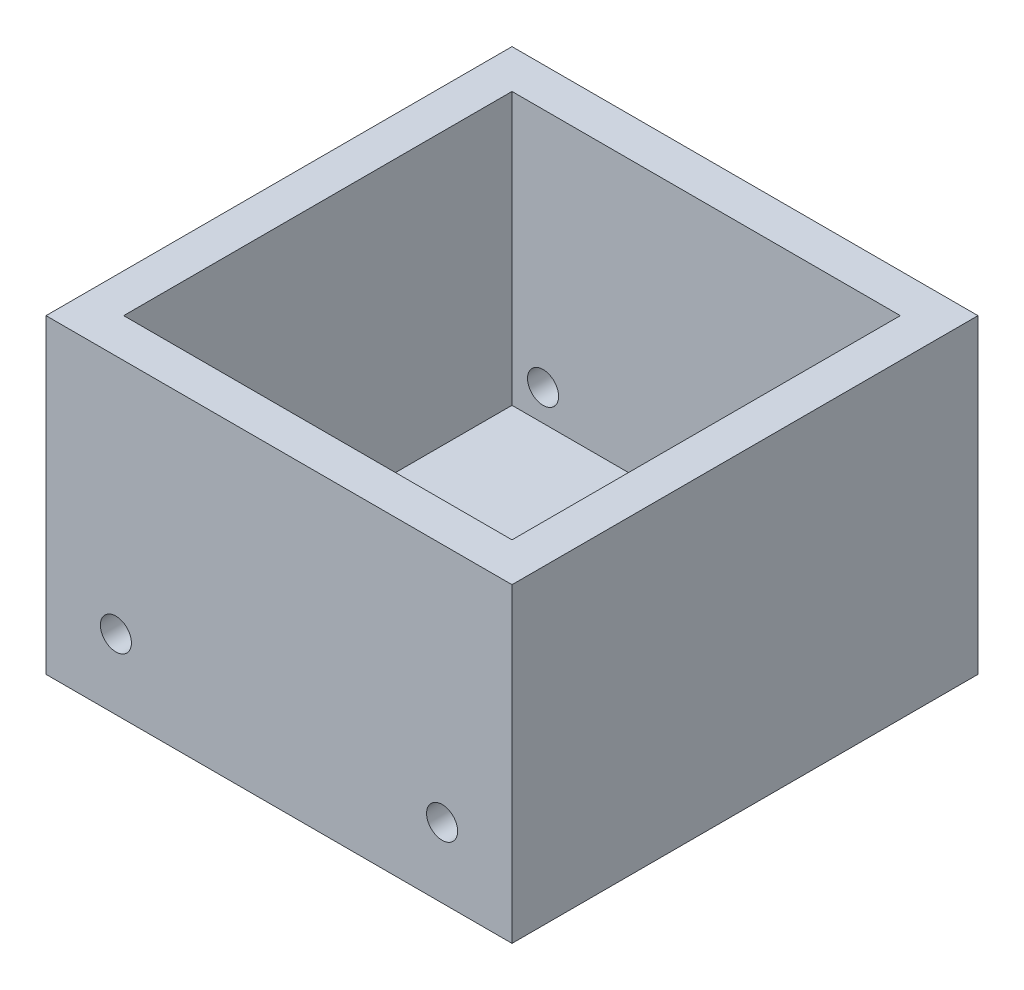
ISO-10303-21;
HEADER;
FILE_DESCRIPTION(('STEP AP214'),'2;1');
FILE_NAME('part.step','',(''),(''),'','','');
FILE_SCHEMA(('AUTOMOTIVE_DESIGN { 1 0 10303 214 1 1 1 1 }'));
ENDSEC;
DATA;
#1=APPLICATION_CONTEXT('core data for automotive mechanical design processes');
#2=APPLICATION_PROTOCOL_DEFINITION('international standard','automotive_design',2000,#1);
#3=PRODUCT_CONTEXT('',#1,'mechanical');
#4=PRODUCT('Part','Part','',(#3));
#5=PRODUCT_RELATED_PRODUCT_CATEGORY('part','',(#4));
#6=PRODUCT_DEFINITION_FORMATION('','',#4);
#7=PRODUCT_DEFINITION_CONTEXT('part definition',#1,'design');
#8=PRODUCT_DEFINITION('design','',#6,#7);
#9=PRODUCT_DEFINITION_SHAPE('','',#8);
#10=(LENGTH_UNIT() NAMED_UNIT(*) SI_UNIT(.MILLI.,.METRE.));
#11=(NAMED_UNIT(*) PLANE_ANGLE_UNIT() SI_UNIT($,.RADIAN.));
#12=(NAMED_UNIT(*) SI_UNIT($,.STERADIAN.) SOLID_ANGLE_UNIT());
#13=UNCERTAINTY_MEASURE_WITH_UNIT(LENGTH_MEASURE(1.E-05),#10,'distance_accuracy_value','');
#14=(GEOMETRIC_REPRESENTATION_CONTEXT(3) GLOBAL_UNCERTAINTY_ASSIGNED_CONTEXT((#13)) GLOBAL_UNIT_ASSIGNED_CONTEXT((#10,
#11,#12)) REPRESENTATION_CONTEXT('',''));
#15=CARTESIAN_POINT('',(0.,0.,0.));
#16=DIRECTION('',(0.,0.,1.));
#17=DIRECTION('',(1.,0.,0.));
#18=AXIS2_PLACEMENT_3D('',#15,#16,#17);
#19=CARTESIAN_POINT('',(0.,101.6,0.));
#20=DIRECTION('',(0.,-1.,0.));
#21=DIRECTION('',(0.,0.,-1.));
#22=AXIS2_PLACEMENT_3D('',#19,#20,#21);
#23=PLANE('',#22);
#24=DIRECTION('',(0.,0.,-1.));
#25=VECTOR('',#24,1.);
#26=CARTESIAN_POINT('',(76.2,101.6,76.2));
#27=LINE('',#26,#25);
#28=CARTESIAN_POINT('',(76.2,101.6,76.2));
#29=VERTEX_POINT('',#28);
#30=CARTESIAN_POINT('',(76.2,101.6,-76.2));
#31=VERTEX_POINT('',#30);
#32=EDGE_CURVE('E144',#29,#31,#27,.T.);
#33=ORIENTED_EDGE('',*,*,#32,.T.);
#34=DIRECTION('',(-1.,0.,0.));
#35=VECTOR('',#34,1.);
#36=CARTESIAN_POINT('',(-76.2,101.6,-76.2));
#37=LINE('',#36,#35);
#38=CARTESIAN_POINT('',(-76.2,101.6,-76.2));
#39=VERTEX_POINT('',#38);
#40=EDGE_CURVE('E88',#31,#39,#37,.T.);
#41=ORIENTED_EDGE('',*,*,#40,.T.);
#42=DIRECTION('',(0.,0.,1.));
#43=VECTOR('',#42,1.);
#44=CARTESIAN_POINT('',(-76.2,101.6,76.2));
#45=LINE('',#44,#43);
#46=CARTESIAN_POINT('',(-76.2,101.6,76.2));
#47=VERTEX_POINT('',#46);
#48=EDGE_CURVE('E147',#39,#47,#45,.T.);
#49=ORIENTED_EDGE('',*,*,#48,.T.);
#50=DIRECTION('',(1.,0.,0.));
#51=VECTOR('',#50,1.);
#52=CARTESIAN_POINT('',(-76.2,101.6,76.2));
#53=LINE('',#52,#51);
#54=EDGE_CURVE('E60',#47,#29,#53,.T.);
#55=ORIENTED_EDGE('',*,*,#54,.T.);
#56=EDGE_LOOP('',(#33,#41,#49,#55));
#57=FACE_BOUND('',#56,.T.);
#58=DIRECTION('',(0.,0.,-1.));
#59=VECTOR('',#58,1.);
#60=CARTESIAN_POINT('',(63.5,101.6,0.));
#61=LINE('',#60,#59);
#62=CARTESIAN_POINT('',(63.5,101.6,63.5));
#63=VERTEX_POINT('',#62);
#64=CARTESIAN_POINT('',(63.5,101.6,-63.5));
#65=VERTEX_POINT('',#64);
#66=EDGE_CURVE('E133',#63,#65,#61,.T.);
#67=ORIENTED_EDGE('',*,*,#66,.F.);
#68=DIRECTION('',(1.,0.,0.));
#69=VECTOR('',#68,1.);
#70=CARTESIAN_POINT('',(0.,101.6,63.5));
#71=LINE('',#70,#69);
#72=CARTESIAN_POINT('',(-63.5,101.6,63.5));
#73=VERTEX_POINT('',#72);
#74=EDGE_CURVE('E142',#73,#63,#71,.T.);
#75=ORIENTED_EDGE('',*,*,#74,.F.);
#76=DIRECTION('',(0.,0.,1.));
#77=VECTOR('',#76,1.);
#78=CARTESIAN_POINT('',(-63.5,101.6,0.));
#79=LINE('',#78,#77);
#80=CARTESIAN_POINT('',(-63.5,101.6,-63.5));
#81=VERTEX_POINT('',#80);
#82=EDGE_CURVE('E140',#81,#73,#79,.T.);
#83=ORIENTED_EDGE('',*,*,#82,.F.);
#84=DIRECTION('',(-1.,0.,0.));
#85=VECTOR('',#84,1.);
#86=CARTESIAN_POINT('',(0.,101.6,-63.5));
#87=LINE('',#86,#85);
#88=EDGE_CURVE('E125',#65,#81,#87,.T.);
#89=ORIENTED_EDGE('',*,*,#88,.F.);
#90=EDGE_LOOP('',(#67,#75,#83,#89));
#91=FACE_BOUND('',#90,.T.);
#92=ADVANCED_FACE('F34',(#57,#91),#23,.F.);
#93=CARTESIAN_POINT('',(76.2,101.6,76.2));
#94=DIRECTION('',(-1.,0.,0.));
#95=DIRECTION('',(0.,0.,1.));
#96=AXIS2_PLACEMENT_3D('',#93,#94,#95);
#97=PLANE('',#96);
#98=DIRECTION('',(0.,0.,-1.));
#99=VECTOR('',#98,1.);
#100=CARTESIAN_POINT('',(76.2,0.,76.2));
#101=LINE('',#100,#99);
#102=CARTESIAN_POINT('',(76.2,0.,76.2));
#103=VERTEX_POINT('',#102);
#104=CARTESIAN_POINT('',(76.2,0.,-76.2));
#105=VERTEX_POINT('',#104);
#106=EDGE_CURVE('E151',#103,#105,#101,.T.);
#107=ORIENTED_EDGE('',*,*,#106,.T.);
#108=DIRECTION('',(0.,-1.,0.));
#109=VECTOR('',#108,1.);
#110=CARTESIAN_POINT('',(76.2,101.6,-76.2));
#111=LINE('',#110,#109);
#112=EDGE_CURVE('E11',#31,#105,#111,.T.);
#113=ORIENTED_EDGE('',*,*,#112,.F.);
#114=ORIENTED_EDGE('',*,*,#32,.F.);
#115=DIRECTION('',(0.,-1.,0.));
#116=VECTOR('',#115,1.);
#117=CARTESIAN_POINT('',(76.2,101.6,76.2));
#118=LINE('',#117,#116);
#119=EDGE_CURVE('E150',#29,#103,#118,.T.);
#120=ORIENTED_EDGE('',*,*,#119,.T.);
#121=EDGE_LOOP('',(#107,#113,#114,#120));
#122=FACE_BOUND('',#121,.T.);
#123=ADVANCED_FACE('F36',(#122),#97,.F.);
#124=CARTESIAN_POINT('',(-76.2,101.6,-76.2));
#125=DIRECTION('',(0.,0.,1.));
#126=DIRECTION('',(1.,0.,0.));
#127=AXIS2_PLACEMENT_3D('',#124,#125,#126);
#128=PLANE('',#127);
#129=CARTESIAN_POINT('',(-53.34,22.86,-76.2));
#130=DIRECTION('',(0.,0.,1.));
#131=DIRECTION('',(1.,0.,0.));
#132=AXIS2_PLACEMENT_3D('',#129,#130,#131);
#133=CIRCLE('',#132,5.08);
#134=CARTESIAN_POINT('',(-48.26,22.86,-76.2));
#135=VERTEX_POINT('',#134);
#136=EDGE_CURVE('E218',#135,#135,#133,.T.);
#137=ORIENTED_EDGE('',*,*,#136,.T.);
#138=EDGE_LOOP('',(#137));
#139=FACE_BOUND('',#138,.T.);
#140=CARTESIAN_POINT('',(53.34,22.8600000000001,-76.2));
#141=DIRECTION('',(0.,0.,1.));
#142=DIRECTION('',(-1.,0.,0.));
#143=AXIS2_PLACEMENT_3D('',#140,#141,#142);
#144=CIRCLE('',#143,5.08);
#145=CARTESIAN_POINT('',(58.42,22.8600000000001,-76.2));
#146=VERTEX_POINT('',#145);
#147=EDGE_CURVE('E221',#146,#146,#144,.T.);
#148=ORIENTED_EDGE('',*,*,#147,.T.);
#149=EDGE_LOOP('',(#148));
#150=FACE_BOUND('',#149,.T.);
#151=DIRECTION('',(-1.,0.,0.));
#152=VECTOR('',#151,1.);
#153=CARTESIAN_POINT('',(-76.2,0.,-76.2));
#154=LINE('',#153,#152);
#155=CARTESIAN_POINT('',(-76.2,0.,-76.2));
#156=VERTEX_POINT('',#155);
#157=EDGE_CURVE('E154',#105,#156,#154,.T.);
#158=ORIENTED_EDGE('',*,*,#157,.T.);
#159=DIRECTION('',(0.,-1.,0.));
#160=VECTOR('',#159,1.);
#161=CARTESIAN_POINT('',(-76.2,101.6,-76.2));
#162=LINE('',#161,#160);
#163=EDGE_CURVE('E43',#39,#156,#162,.T.);
#164=ORIENTED_EDGE('',*,*,#163,.F.);
#165=ORIENTED_EDGE('',*,*,#40,.F.);
#166=ORIENTED_EDGE('',*,*,#112,.T.);
#167=EDGE_LOOP('',(#158,#164,#165,#166));
#168=FACE_BOUND('',#167,.T.);
#169=ADVANCED_FACE('F195',(#139,#150,#168),#128,.F.);
#170=CARTESIAN_POINT('',(-76.2,101.6,76.2));
#171=DIRECTION('',(1.,0.,0.));
#172=DIRECTION('',(0.,0.,-1.));
#173=AXIS2_PLACEMENT_3D('',#170,#171,#172);
#174=PLANE('',#173);
#175=DIRECTION('',(0.,0.,1.));
#176=VECTOR('',#175,1.);
#177=CARTESIAN_POINT('',(-76.2,0.,76.2));
#178=LINE('',#177,#176);
#179=CARTESIAN_POINT('',(-76.2,0.,76.2));
#180=VERTEX_POINT('',#179);
#181=EDGE_CURVE('E156',#156,#180,#178,.T.);
#182=ORIENTED_EDGE('',*,*,#181,.T.);
#183=DIRECTION('',(0.,-1.,0.));
#184=VECTOR('',#183,1.);
#185=CARTESIAN_POINT('',(-76.2,101.6,76.2));
#186=LINE('',#185,#184);
#187=EDGE_CURVE('E160',#47,#180,#186,.T.);
#188=ORIENTED_EDGE('',*,*,#187,.F.);
#189=ORIENTED_EDGE('',*,*,#48,.F.);
#190=ORIENTED_EDGE('',*,*,#163,.T.);
#191=EDGE_LOOP('',(#182,#188,#189,#190));
#192=FACE_BOUND('',#191,.T.);
#193=ADVANCED_FACE('F207',(#192),#174,.F.);
#194=CARTESIAN_POINT('',(-76.2,101.6,76.2));
#195=DIRECTION('',(0.,0.,-1.));
#196=DIRECTION('',(-1.,0.,0.));
#197=AXIS2_PLACEMENT_3D('',#194,#195,#196);
#198=PLANE('',#197);
#199=CARTESIAN_POINT('',(-53.34,22.86,76.2));
#200=DIRECTION('',(0.,0.,1.));
#201=DIRECTION('',(1.,0.,0.));
#202=AXIS2_PLACEMENT_3D('',#199,#200,#201);
#203=CIRCLE('',#202,5.08);
#204=CARTESIAN_POINT('',(-48.26,22.86,76.2));
#205=VERTEX_POINT('',#204);
#206=EDGE_CURVE('E165',#205,#205,#203,.T.);
#207=ORIENTED_EDGE('',*,*,#206,.F.);
#208=EDGE_LOOP('',(#207));
#209=FACE_BOUND('',#208,.T.);
#210=CARTESIAN_POINT('',(53.34,22.8600000000001,76.2));
#211=DIRECTION('',(0.,0.,1.));
#212=DIRECTION('',(-1.,0.,0.));
#213=AXIS2_PLACEMENT_3D('',#210,#211,#212);
#214=CIRCLE('',#213,5.08);
#215=CARTESIAN_POINT('',(48.26,22.8600000000001,76.2));
#216=VERTEX_POINT('',#215);
#217=EDGE_CURVE('E170',#216,#216,#214,.T.);
#218=ORIENTED_EDGE('',*,*,#217,.F.);
#219=EDGE_LOOP('',(#218));
#220=FACE_BOUND('',#219,.T.);
#221=DIRECTION('',(1.,0.,0.));
#222=VECTOR('',#221,1.);
#223=CARTESIAN_POINT('',(-76.2,0.,76.2));
#224=LINE('',#223,#222);
#225=EDGE_CURVE('E81',#180,#103,#224,.T.);
#226=ORIENTED_EDGE('',*,*,#225,.T.);
#227=ORIENTED_EDGE('',*,*,#119,.F.);
#228=ORIENTED_EDGE('',*,*,#54,.F.);
#229=ORIENTED_EDGE('',*,*,#187,.T.);
#230=EDGE_LOOP('',(#226,#227,#228,#229));
#231=FACE_BOUND('',#230,.T.);
#232=ADVANCED_FACE('F203',(#209,#220,#231),#198,.F.);
#233=CARTESIAN_POINT('',(0.,0.,0.));
#234=DIRECTION('',(0.,-1.,0.));
#235=DIRECTION('',(0.,0.,-1.));
#236=AXIS2_PLACEMENT_3D('',#233,#234,#235);
#237=PLANE('',#236);
#238=ORIENTED_EDGE('',*,*,#106,.F.);
#239=ORIENTED_EDGE('',*,*,#225,.F.);
#240=ORIENTED_EDGE('',*,*,#181,.F.);
#241=ORIENTED_EDGE('',*,*,#157,.F.);
#242=EDGE_LOOP('',(#238,#239,#240,#241));
#243=FACE_BOUND('',#242,.T.);
#244=ADVANCED_FACE('F200',(#243),#237,.T.);
#245=CARTESIAN_POINT('',(63.5,101.6,76.2));
#246=DIRECTION('',(-1.,0.,0.));
#247=DIRECTION('',(0.,0.,1.));
#248=AXIS2_PLACEMENT_3D('',#245,#246,#247);
#249=PLANE('',#248);
#250=DIRECTION('',(0.,0.,-1.));
#251=VECTOR('',#250,1.);
#252=CARTESIAN_POINT('',(63.5,12.7,0.));
#253=LINE('',#252,#251);
#254=CARTESIAN_POINT('',(63.5,12.7,63.5));
#255=VERTEX_POINT('',#254);
#256=CARTESIAN_POINT('',(63.5,12.7,-63.5));
#257=VERTEX_POINT('',#256);
#258=EDGE_CURVE('E116',#255,#257,#253,.T.);
#259=ORIENTED_EDGE('',*,*,#258,.F.);
#260=DIRECTION('',(0.,-1.,0.));
#261=VECTOR('',#260,1.);
#262=CARTESIAN_POINT('',(63.5,101.6,63.5));
#263=LINE('',#262,#261);
#264=EDGE_CURVE('E136',#63,#255,#263,.T.);
#265=ORIENTED_EDGE('',*,*,#264,.F.);
#266=ORIENTED_EDGE('',*,*,#66,.T.);
#267=DIRECTION('',(0.,-1.,0.));
#268=VECTOR('',#267,1.);
#269=CARTESIAN_POINT('',(63.5,101.6,-63.5));
#270=LINE('',#269,#268);
#271=EDGE_CURVE('E128',#65,#257,#270,.T.);
#272=ORIENTED_EDGE('',*,*,#271,.T.);
#273=EDGE_LOOP('',(#259,#265,#266,#272));
#274=FACE_BOUND('',#273,.T.);
#275=ADVANCED_FACE('F188',(#274),#249,.T.);
#276=CARTESIAN_POINT('',(-76.2,101.6,-63.5));
#277=DIRECTION('',(0.,0.,1.));
#278=DIRECTION('',(1.,0.,0.));
#279=AXIS2_PLACEMENT_3D('',#276,#277,#278);
#280=PLANE('',#279);
#281=CARTESIAN_POINT('',(-53.34,22.86,-63.5));
#282=DIRECTION('',(0.,0.,1.));
#283=DIRECTION('',(1.,0.,0.));
#284=AXIS2_PLACEMENT_3D('',#281,#282,#283);
#285=CIRCLE('',#284,5.08);
#286=CARTESIAN_POINT('',(-48.26,22.86,-63.5));
#287=VERTEX_POINT('',#286);
#288=EDGE_CURVE('E175',#287,#287,#285,.T.);
#289=ORIENTED_EDGE('',*,*,#288,.F.);
#290=EDGE_LOOP('',(#289));
#291=FACE_BOUND('',#290,.T.);
#292=CARTESIAN_POINT('',(53.34,22.8600000000001,-63.5));
#293=DIRECTION('',(0.,0.,1.));
#294=DIRECTION('',(1.,0.,0.));
#295=AXIS2_PLACEMENT_3D('',#292,#293,#294);
#296=CIRCLE('',#295,5.08);
#297=CARTESIAN_POINT('',(58.42,22.8600000000001,-63.5));
#298=VERTEX_POINT('',#297);
#299=EDGE_CURVE('E230',#298,#298,#296,.T.);
#300=ORIENTED_EDGE('',*,*,#299,.F.);
#301=EDGE_LOOP('',(#300));
#302=FACE_BOUND('',#301,.T.);
#303=DIRECTION('',(-1.,0.,0.));
#304=VECTOR('',#303,1.);
#305=CARTESIAN_POINT('',(0.,12.7,-63.5));
#306=LINE('',#305,#304);
#307=CARTESIAN_POINT('',(-63.5,12.7,-63.5));
#308=VERTEX_POINT('',#307);
#309=EDGE_CURVE('E110',#257,#308,#306,.T.);
#310=ORIENTED_EDGE('',*,*,#309,.F.);
#311=ORIENTED_EDGE('',*,*,#271,.F.);
#312=ORIENTED_EDGE('',*,*,#88,.T.);
#313=DIRECTION('',(0.,-1.,0.));
#314=VECTOR('',#313,1.);
#315=CARTESIAN_POINT('',(-63.5,101.6,-63.5));
#316=LINE('',#315,#314);
#317=EDGE_CURVE('E122',#81,#308,#316,.T.);
#318=ORIENTED_EDGE('',*,*,#317,.T.);
#319=EDGE_LOOP('',(#310,#311,#312,#318));
#320=FACE_BOUND('',#319,.T.);
#321=ADVANCED_FACE('F123',(#291,#302,#320),#280,.T.);
#322=CARTESIAN_POINT('',(-63.5,101.6,76.2));
#323=DIRECTION('',(1.,0.,0.));
#324=DIRECTION('',(0.,0.,-1.));
#325=AXIS2_PLACEMENT_3D('',#322,#323,#324);
#326=PLANE('',#325);
#327=DIRECTION('',(0.,0.,1.));
#328=VECTOR('',#327,1.);
#329=CARTESIAN_POINT('',(-63.5,12.7,0.));
#330=LINE('',#329,#328);
#331=CARTESIAN_POINT('',(-63.5,12.7,63.5));
#332=VERTEX_POINT('',#331);
#333=EDGE_CURVE('E114',#308,#332,#330,.T.);
#334=ORIENTED_EDGE('',*,*,#333,.F.);
#335=ORIENTED_EDGE('',*,*,#317,.F.);
#336=ORIENTED_EDGE('',*,*,#82,.T.);
#337=DIRECTION('',(0.,-1.,0.));
#338=VECTOR('',#337,1.);
#339=CARTESIAN_POINT('',(-63.5,101.6,63.5));
#340=LINE('',#339,#338);
#341=EDGE_CURVE('E51',#73,#332,#340,.T.);
#342=ORIENTED_EDGE('',*,*,#341,.T.);
#343=EDGE_LOOP('',(#334,#335,#336,#342));
#344=FACE_BOUND('',#343,.T.);
#345=ADVANCED_FACE('F130',(#344),#326,.T.);
#346=CARTESIAN_POINT('',(-76.2,101.6,63.5));
#347=DIRECTION('',(0.,0.,-1.));
#348=DIRECTION('',(-1.,0.,0.));
#349=AXIS2_PLACEMENT_3D('',#346,#347,#348);
#350=PLANE('',#349);
#351=CARTESIAN_POINT('',(-53.34,22.86,63.5));
#352=DIRECTION('',(0.,0.,-1.));
#353=DIRECTION('',(-1.,0.,0.));
#354=AXIS2_PLACEMENT_3D('',#351,#352,#353);
#355=CIRCLE('',#354,5.08);
#356=CARTESIAN_POINT('',(-58.42,22.86,63.5));
#357=VERTEX_POINT('',#356);
#358=EDGE_CURVE('E38',#357,#357,#355,.F.);
#359=ORIENTED_EDGE('',*,*,#358,.T.);
#360=EDGE_LOOP('',(#359));
#361=FACE_BOUND('',#360,.T.);
#362=CARTESIAN_POINT('',(53.34,22.8600000000001,63.5));
#363=DIRECTION('',(0.,0.,-1.));
#364=DIRECTION('',(-1.,0.,0.));
#365=AXIS2_PLACEMENT_3D('',#362,#363,#364);
#366=CIRCLE('',#365,5.08);
#367=CARTESIAN_POINT('',(48.26,22.8600000000001,63.5));
#368=VERTEX_POINT('',#367);
#369=EDGE_CURVE('E163',#368,#368,#366,.F.);
#370=ORIENTED_EDGE('',*,*,#369,.T.);
#371=EDGE_LOOP('',(#370));
#372=FACE_BOUND('',#371,.T.);
#373=DIRECTION('',(1.,0.,0.));
#374=VECTOR('',#373,1.);
#375=CARTESIAN_POINT('',(0.,12.7,63.5));
#376=LINE('',#375,#374);
#377=EDGE_CURVE('E131',#332,#255,#376,.T.);
#378=ORIENTED_EDGE('',*,*,#377,.F.);
#379=ORIENTED_EDGE('',*,*,#341,.F.);
#380=ORIENTED_EDGE('',*,*,#74,.T.);
#381=ORIENTED_EDGE('',*,*,#264,.T.);
#382=EDGE_LOOP('',(#378,#379,#380,#381));
#383=FACE_BOUND('',#382,.T.);
#384=ADVANCED_FACE('F184',(#361,#372,#383),#350,.T.);
#385=CARTESIAN_POINT('',(0.,12.7,0.));
#386=DIRECTION('',(0.,-1.,0.));
#387=DIRECTION('',(0.,0.,-1.));
#388=AXIS2_PLACEMENT_3D('',#385,#386,#387);
#389=PLANE('',#388);
#390=ORIENTED_EDGE('',*,*,#258,.T.);
#391=ORIENTED_EDGE('',*,*,#309,.T.);
#392=ORIENTED_EDGE('',*,*,#333,.T.);
#393=ORIENTED_EDGE('',*,*,#377,.T.);
#394=EDGE_LOOP('',(#390,#391,#392,#393));
#395=FACE_BOUND('',#394,.T.);
#396=ADVANCED_FACE('F112',(#395),#389,.F.);
#397=CARTESIAN_POINT('',(53.34,22.8600000000001,76.2));
#398=DIRECTION('',(0.,0.,-1.));
#399=DIRECTION('',(-1.,0.,0.));
#400=AXIS2_PLACEMENT_3D('',#397,#398,#399);
#401=CYLINDRICAL_SURFACE('',#400,5.08);
#402=ORIENTED_EDGE('',*,*,#369,.F.);
#403=EDGE_LOOP('',(#402));
#404=FACE_BOUND('',#403,.T.);
#405=ORIENTED_EDGE('',*,*,#217,.T.);
#406=EDGE_LOOP('',(#405));
#407=FACE_BOUND('',#406,.T.);
#408=ADVANCED_FACE('F256',(#404,#407),#401,.F.);
#409=CARTESIAN_POINT('',(-53.34,22.86,76.2));
#410=DIRECTION('',(0.,0.,-1.));
#411=DIRECTION('',(-1.,0.,0.));
#412=AXIS2_PLACEMENT_3D('',#409,#410,#411);
#413=CYLINDRICAL_SURFACE('',#412,5.08);
#414=ORIENTED_EDGE('',*,*,#358,.F.);
#415=EDGE_LOOP('',(#414));
#416=FACE_BOUND('',#415,.T.);
#417=ORIENTED_EDGE('',*,*,#206,.T.);
#418=EDGE_LOOP('',(#417));
#419=FACE_BOUND('',#418,.T.);
#420=ADVANCED_FACE('F259',(#416,#419),#413,.F.);
#421=CARTESIAN_POINT('',(53.34,22.8600000000001,-76.2));
#422=DIRECTION('',(0.,0.,1.));
#423=DIRECTION('',(1.,0.,0.));
#424=AXIS2_PLACEMENT_3D('',#421,#422,#423);
#425=CYLINDRICAL_SURFACE('',#424,5.08);
#426=CARTESIAN_POINT('',(58.42,22.8600000000001,-63.5));
#427=CARTESIAN_POINT('',(58.42,22.8600000000001,-63.6322916666667));
#428=CARTESIAN_POINT('',(58.42,22.8600000000001,-63.7645833333333));
#429=CARTESIAN_POINT('',(58.42,22.8600000000001,-64.0291666666667));
#430=CARTESIAN_POINT('',(58.42,22.8600000000001,-64.1614583333334));
#431=CARTESIAN_POINT('',(58.42,22.8600000000001,-64.4260416666667));
#432=CARTESIAN_POINT('',(58.42,22.8600000000001,-64.5583333333334));
#433=CARTESIAN_POINT('',(58.42,22.8600000000001,-64.8229166666667));
#434=CARTESIAN_POINT('',(58.42,22.8600000000001,-64.9552083333334));
#435=CARTESIAN_POINT('',(58.42,22.8600000000001,-65.2197916666667));
#436=CARTESIAN_POINT('',(58.42,22.8600000000001,-65.3520833333334));
#437=CARTESIAN_POINT('',(58.42,22.8600000000001,-65.6166666666667));
#438=CARTESIAN_POINT('',(58.42,22.8600000000001,-65.7489583333334));
#439=CARTESIAN_POINT('',(58.42,22.8600000000001,-66.0135416666667));
#440=CARTESIAN_POINT('',(58.42,22.8600000000001,-66.1458333333334));
#441=CARTESIAN_POINT('',(58.42,22.8600000000001,-66.4104166666667));
#442=CARTESIAN_POINT('',(58.42,22.8600000000001,-66.5427083333334));
#443=CARTESIAN_POINT('',(58.42,22.8600000000001,-66.8072916666667));
#444=CARTESIAN_POINT('',(58.42,22.8600000000001,-66.9395833333334));
#445=CARTESIAN_POINT('',(58.42,22.8600000000001,-67.2041666666667));
#446=CARTESIAN_POINT('',(58.42,22.8600000000001,-67.3364583333334));
#447=CARTESIAN_POINT('',(58.42,22.8600000000001,-67.6010416666667));
#448=CARTESIAN_POINT('',(58.42,22.8600000000001,-67.7333333333333));
#449=CARTESIAN_POINT('',(58.42,22.8600000000001,-67.9979166666667));
#450=CARTESIAN_POINT('',(58.42,22.8600000000001,-68.1302083333334));
#451=CARTESIAN_POINT('',(58.42,22.8600000000001,-68.3947916666667));
#452=CARTESIAN_POINT('',(58.42,22.8600000000001,-68.5270833333334));
#453=CARTESIAN_POINT('',(58.42,22.8600000000001,-68.7916666666667));
#454=CARTESIAN_POINT('',(58.42,22.8600000000001,-68.9239583333334));
#455=CARTESIAN_POINT('',(58.42,22.8600000000001,-69.1885416666667));
#456=CARTESIAN_POINT('',(58.42,22.8600000000001,-69.3208333333334));
#457=CARTESIAN_POINT('',(58.42,22.8600000000001,-69.5854166666667));
#458=CARTESIAN_POINT('',(58.42,22.8600000000001,-69.7177083333334));
#459=CARTESIAN_POINT('',(58.42,22.8600000000001,-69.9822916666667));
#460=CARTESIAN_POINT('',(58.42,22.8600000000001,-70.1145833333334));
#461=CARTESIAN_POINT('',(58.42,22.8600000000001,-70.3791666666667));
#462=CARTESIAN_POINT('',(58.42,22.8600000000001,-70.5114583333334));
#463=CARTESIAN_POINT('',(58.42,22.8600000000001,-70.7760416666667));
#464=CARTESIAN_POINT('',(58.42,22.8600000000001,-70.9083333333334));
#465=CARTESIAN_POINT('',(58.42,22.8600000000001,-71.1729166666667));
#466=CARTESIAN_POINT('',(58.42,22.8600000000001,-71.3052083333334));
#467=CARTESIAN_POINT('',(58.42,22.8600000000001,-71.5697916666667));
#468=CARTESIAN_POINT('',(58.42,22.8600000000001,-71.7020833333334));
#469=CARTESIAN_POINT('',(58.42,22.8600000000001,-71.9666666666667));
#470=CARTESIAN_POINT('',(58.42,22.8600000000001,-72.0989583333334));
#471=CARTESIAN_POINT('',(58.42,22.8600000000001,-72.3635416666667));
#472=CARTESIAN_POINT('',(58.42,22.8600000000001,-72.4958333333334));
#473=CARTESIAN_POINT('',(58.42,22.8600000000001,-72.7604166666667));
#474=CARTESIAN_POINT('',(58.42,22.8600000000001,-72.8927083333334));
#475=CARTESIAN_POINT('',(58.42,22.8600000000001,-73.1572916666667));
#476=CARTESIAN_POINT('',(58.42,22.8600000000001,-73.2895833333334));
#477=CARTESIAN_POINT('',(58.42,22.8600000000001,-73.5541666666667));
#478=CARTESIAN_POINT('',(58.42,22.8600000000001,-73.6864583333334));
#479=CARTESIAN_POINT('',(58.42,22.8600000000001,-73.9510416666667));
#480=CARTESIAN_POINT('',(58.42,22.8600000000001,-74.0833333333334));
#481=CARTESIAN_POINT('',(58.42,22.8600000000001,-74.3479166666667));
#482=CARTESIAN_POINT('',(58.42,22.8600000000001,-74.4802083333334));
#483=CARTESIAN_POINT('',(58.42,22.8600000000001,-74.7447916666667));
#484=CARTESIAN_POINT('',(58.42,22.8600000000001,-74.8770833333334));
#485=CARTESIAN_POINT('',(58.42,22.8600000000001,-75.1416666666667));
#486=CARTESIAN_POINT('',(58.42,22.8600000000001,-75.2739583333334));
#487=CARTESIAN_POINT('',(58.42,22.8600000000001,-75.5385416666667));
#488=CARTESIAN_POINT('',(58.42,22.8600000000001,-75.6708333333334));
#489=CARTESIAN_POINT('',(58.42,22.8600000000001,-75.9354166666667));
#490=CARTESIAN_POINT('',(58.42,22.8600000000001,-76.0677083333334));
#491=CARTESIAN_POINT('',(58.42,22.8600000000001,-76.2));
#492=B_SPLINE_CURVE_WITH_KNOTS('',3,(#426,#427,#428,#429,#430,#431,#432,#433,#434,#435,#436,
#437,#438,#439,#440,#441,#442,#443,#444,#445,#446,#447,#448,#449,#450,#451,#452,#453,#454,#455,
#456,#457,#458,#459,#460,#461,#462,#463,#464,#465,#466,#467,#468,#469,#470,#471,#472,#473,#474,
#475,#476,#477,#478,#479,#480,#481,#482,#483,#484,#485,#486,#487,#488,#489,#490,#491),
.UNSPECIFIED.,.F.,.F.,(4,2,2,2,2,2,2,2,2,2,2,2,2,2,2,2,2,2,2,2,2,2,2,2,2,2,2,2,2,2,2,2,4),(0.,
0.396875000000005,0.79375000000001,1.19062500000001,1.58750000000001,1.98437500000001,
2.38125000000002,2.77812500000001,3.17500000000001,3.57187500000002,3.96875000000001,
4.36562500000001,4.76250000000002,5.15937500000001,5.55625000000001,5.95312500000002,
6.35000000000001,6.74687500000001,7.14375000000002,7.54062500000001,7.93750000000001,
8.33437500000002,8.73125000000002,9.12812500000001,9.52500000000002,9.92187500000002,10.31875,
10.715625,11.1125,11.509375,11.90625,12.303125,12.7),.UNSPECIFIED.);
#493=EDGE_CURVE('BSEAM261',#298,#146,#492,.T.);
#494=ORIENTED_EDGE('',*,*,#299,.T.);
#495=ORIENTED_EDGE('',*,*,#147,.F.);
#496=ORIENTED_EDGE('',*,*,#493,.T.);
#497=ORIENTED_EDGE('',*,*,#493,.F.);
#498=EDGE_LOOP('',(#494,#496,#495,#497));
#499=FACE_BOUND('',#498,.T.);
#500=ADVANCED_FACE('F261',(#499),#425,.F.);
#501=CARTESIAN_POINT('',(-53.34,22.86,-76.2));
#502=DIRECTION('',(0.,0.,1.));
#503=DIRECTION('',(1.,0.,0.));
#504=AXIS2_PLACEMENT_3D('',#501,#502,#503);
#505=CYLINDRICAL_SURFACE('',#504,5.08);
#506=CARTESIAN_POINT('',(-48.26,22.86,-63.5));
#507=CARTESIAN_POINT('',(-48.26,22.86,-63.6322916666667));
#508=CARTESIAN_POINT('',(-48.26,22.86,-63.7645833333333));
#509=CARTESIAN_POINT('',(-48.26,22.86,-64.0291666666667));
#510=CARTESIAN_POINT('',(-48.26,22.86,-64.1614583333334));
#511=CARTESIAN_POINT('',(-48.26,22.86,-64.4260416666667));
#512=CARTESIAN_POINT('',(-48.26,22.86,-64.5583333333334));
#513=CARTESIAN_POINT('',(-48.26,22.86,-64.8229166666667));
#514=CARTESIAN_POINT('',(-48.26,22.86,-64.9552083333334));
#515=CARTESIAN_POINT('',(-48.26,22.86,-65.2197916666667));
#516=CARTESIAN_POINT('',(-48.26,22.86,-65.3520833333334));
#517=CARTESIAN_POINT('',(-48.26,22.86,-65.6166666666667));
#518=CARTESIAN_POINT('',(-48.26,22.86,-65.7489583333334));
#519=CARTESIAN_POINT('',(-48.26,22.86,-66.0135416666667));
#520=CARTESIAN_POINT('',(-48.26,22.86,-66.1458333333334));
#521=CARTESIAN_POINT('',(-48.26,22.86,-66.4104166666667));
#522=CARTESIAN_POINT('',(-48.26,22.86,-66.5427083333334));
#523=CARTESIAN_POINT('',(-48.26,22.86,-66.8072916666667));
#524=CARTESIAN_POINT('',(-48.26,22.86,-66.9395833333334));
#525=CARTESIAN_POINT('',(-48.26,22.86,-67.2041666666667));
#526=CARTESIAN_POINT('',(-48.26,22.86,-67.3364583333334));
#527=CARTESIAN_POINT('',(-48.26,22.86,-67.6010416666667));
#528=CARTESIAN_POINT('',(-48.26,22.86,-67.7333333333333));
#529=CARTESIAN_POINT('',(-48.26,22.86,-67.9979166666667));
#530=CARTESIAN_POINT('',(-48.26,22.86,-68.1302083333334));
#531=CARTESIAN_POINT('',(-48.26,22.86,-68.3947916666667));
#532=CARTESIAN_POINT('',(-48.26,22.86,-68.5270833333334));
#533=CARTESIAN_POINT('',(-48.26,22.86,-68.7916666666667));
#534=CARTESIAN_POINT('',(-48.26,22.86,-68.9239583333334));
#535=CARTESIAN_POINT('',(-48.26,22.86,-69.1885416666667));
#536=CARTESIAN_POINT('',(-48.26,22.86,-69.3208333333334));
#537=CARTESIAN_POINT('',(-48.26,22.86,-69.5854166666667));
#538=CARTESIAN_POINT('',(-48.26,22.86,-69.7177083333334));
#539=CARTESIAN_POINT('',(-48.26,22.86,-69.9822916666667));
#540=CARTESIAN_POINT('',(-48.26,22.86,-70.1145833333334));
#541=CARTESIAN_POINT('',(-48.26,22.86,-70.3791666666667));
#542=CARTESIAN_POINT('',(-48.26,22.86,-70.5114583333334));
#543=CARTESIAN_POINT('',(-48.26,22.86,-70.7760416666667));
#544=CARTESIAN_POINT('',(-48.26,22.86,-70.9083333333334));
#545=CARTESIAN_POINT('',(-48.26,22.86,-71.1729166666667));
#546=CARTESIAN_POINT('',(-48.26,22.86,-71.3052083333334));
#547=CARTESIAN_POINT('',(-48.26,22.86,-71.5697916666667));
#548=CARTESIAN_POINT('',(-48.26,22.86,-71.7020833333334));
#549=CARTESIAN_POINT('',(-48.26,22.86,-71.9666666666667));
#550=CARTESIAN_POINT('',(-48.26,22.86,-72.0989583333334));
#551=CARTESIAN_POINT('',(-48.26,22.86,-72.3635416666667));
#552=CARTESIAN_POINT('',(-48.26,22.86,-72.4958333333334));
#553=CARTESIAN_POINT('',(-48.26,22.86,-72.7604166666667));
#554=CARTESIAN_POINT('',(-48.26,22.86,-72.8927083333334));
#555=CARTESIAN_POINT('',(-48.26,22.86,-73.1572916666667));
#556=CARTESIAN_POINT('',(-48.26,22.86,-73.2895833333334));
#557=CARTESIAN_POINT('',(-48.26,22.86,-73.5541666666667));
#558=CARTESIAN_POINT('',(-48.26,22.86,-73.6864583333334));
#559=CARTESIAN_POINT('',(-48.26,22.86,-73.9510416666667));
#560=CARTESIAN_POINT('',(-48.26,22.86,-74.0833333333334));
#561=CARTESIAN_POINT('',(-48.26,22.86,-74.3479166666667));
#562=CARTESIAN_POINT('',(-48.26,22.86,-74.4802083333334));
#563=CARTESIAN_POINT('',(-48.26,22.86,-74.7447916666667));
#564=CARTESIAN_POINT('',(-48.26,22.86,-74.8770833333334));
#565=CARTESIAN_POINT('',(-48.26,22.86,-75.1416666666667));
#566=CARTESIAN_POINT('',(-48.26,22.86,-75.2739583333334));
#567=CARTESIAN_POINT('',(-48.26,22.86,-75.5385416666667));
#568=CARTESIAN_POINT('',(-48.26,22.86,-75.6708333333334));
#569=CARTESIAN_POINT('',(-48.26,22.86,-75.9354166666667));
#570=CARTESIAN_POINT('',(-48.26,22.86,-76.0677083333334));
#571=CARTESIAN_POINT('',(-48.26,22.86,-76.2));
#572=B_SPLINE_CURVE_WITH_KNOTS('',3,(#506,#507,#508,#509,#510,#511,#512,#513,#514,#515,#516,
#517,#518,#519,#520,#521,#522,#523,#524,#525,#526,#527,#528,#529,#530,#531,#532,#533,#534,#535,
#536,#537,#538,#539,#540,#541,#542,#543,#544,#545,#546,#547,#548,#549,#550,#551,#552,#553,#554,
#555,#556,#557,#558,#559,#560,#561,#562,#563,#564,#565,#566,#567,#568,#569,#570,#571),
.UNSPECIFIED.,.F.,.F.,(4,2,2,2,2,2,2,2,2,2,2,2,2,2,2,2,2,2,2,2,2,2,2,2,2,2,2,2,2,2,2,2,4),(0.,
0.396875000000005,0.79375000000001,1.19062500000001,1.58750000000001,1.98437500000001,
2.38125000000002,2.77812500000001,3.17500000000001,3.57187500000002,3.96875000000001,
4.36562500000001,4.76250000000002,5.15937500000001,5.55625000000001,5.95312500000002,
6.35000000000001,6.74687500000001,7.14375000000002,7.54062500000001,7.93750000000001,
8.33437500000002,8.73125000000002,9.12812500000001,9.52500000000002,9.92187500000002,10.31875,
10.715625,11.1125,11.509375,11.90625,12.303125,12.7),.UNSPECIFIED.);
#573=EDGE_CURVE('BSEAM238',#287,#135,#572,.T.);
#574=ORIENTED_EDGE('',*,*,#288,.T.);
#575=ORIENTED_EDGE('',*,*,#136,.F.);
#576=ORIENTED_EDGE('',*,*,#573,.T.);
#577=ORIENTED_EDGE('',*,*,#573,.F.);
#578=EDGE_LOOP('',(#574,#576,#575,#577));
#579=FACE_BOUND('',#578,.T.);
#580=ADVANCED_FACE('F238',(#579),#505,.F.);
#581=CLOSED_SHELL('',(#92,#123,#169,#193,#232,#244,#275,#321,#345,#384,#396,#408,#420,#500,#580));
#582=MANIFOLD_SOLID_BREP('B2',#581);
#583=ADVANCED_BREP_SHAPE_REPRESENTATION('',(#18,#582),#14);
#584=SHAPE_DEFINITION_REPRESENTATION(#9,#583);
ENDSEC;
END-ISO-10303-21;
